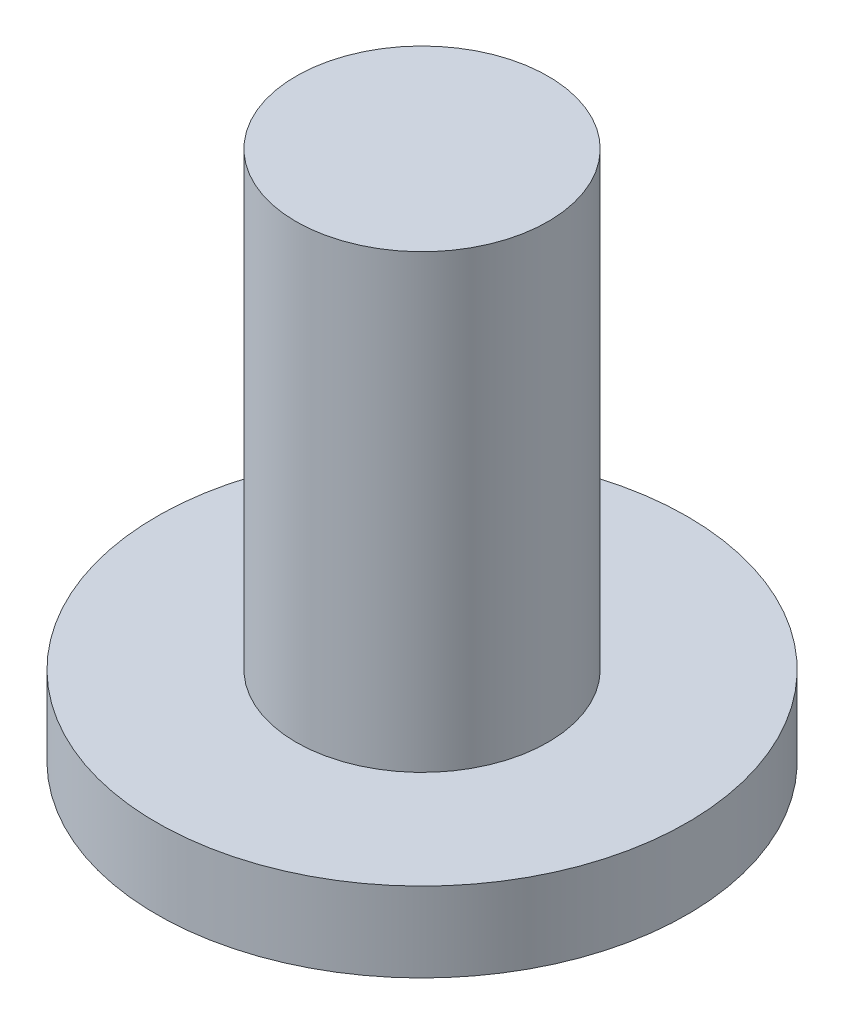
ISO-10303-21;
HEADER;
FILE_DESCRIPTION(('STEP AP214'),'2;1');
FILE_NAME('part.step','',(''),(''),'','','');
FILE_SCHEMA(('AUTOMOTIVE_DESIGN { 1 0 10303 214 1 1 1 1 }'));
ENDSEC;
DATA;
#1=APPLICATION_CONTEXT('core data for automotive mechanical design processes');
#2=APPLICATION_PROTOCOL_DEFINITION('international standard','automotive_design',2000,#1);
#3=PRODUCT_CONTEXT('',#1,'mechanical');
#4=PRODUCT('Part','Part','',(#3));
#5=PRODUCT_RELATED_PRODUCT_CATEGORY('part','',(#4));
#6=PRODUCT_DEFINITION_FORMATION('','',#4);
#7=PRODUCT_DEFINITION_CONTEXT('part definition',#1,'design');
#8=PRODUCT_DEFINITION('design','',#6,#7);
#9=PRODUCT_DEFINITION_SHAPE('','',#8);
#10=(LENGTH_UNIT() NAMED_UNIT(*) SI_UNIT(.MILLI.,.METRE.));
#11=(NAMED_UNIT(*) PLANE_ANGLE_UNIT() SI_UNIT($,.RADIAN.));
#12=(NAMED_UNIT(*) SI_UNIT($,.STERADIAN.) SOLID_ANGLE_UNIT());
#13=UNCERTAINTY_MEASURE_WITH_UNIT(LENGTH_MEASURE(1.E-05),#10,'distance_accuracy_value','');
#14=(GEOMETRIC_REPRESENTATION_CONTEXT(3) GLOBAL_UNCERTAINTY_ASSIGNED_CONTEXT((#13)) GLOBAL_UNIT_ASSIGNED_CONTEXT((#10,
#11,#12)) REPRESENTATION_CONTEXT('',''));
#15=CARTESIAN_POINT('',(0.,0.,0.));
#16=DIRECTION('',(0.,0.,1.));
#17=DIRECTION('',(1.,0.,0.));
#18=AXIS2_PLACEMENT_3D('',#15,#16,#17);
#19=CARTESIAN_POINT('',(0.,17.,0.));
#20=DIRECTION('',(0.,-1.,0.));
#21=DIRECTION('',(0.,0.,-1.));
#22=AXIS2_PLACEMENT_3D('',#19,#20,#21);
#23=CYLINDRICAL_SURFACE('',#22,4.75);
#24=CARTESIAN_POINT('',(0.,17.,0.));
#25=DIRECTION('',(0.,1.,0.));
#26=DIRECTION('',(0.,0.,1.));
#27=AXIS2_PLACEMENT_3D('',#24,#25,#26);
#28=CIRCLE('',#27,4.75);
#29=CARTESIAN_POINT('',(0.,17.,4.75));
#30=VERTEX_POINT('',#29);
#31=EDGE_CURVE('E10',#30,#30,#28,.T.);
#32=ORIENTED_EDGE('',*,*,#31,.F.);
#33=EDGE_LOOP('',(#32));
#34=FACE_BOUND('',#33,.T.);
#35=CARTESIAN_POINT('',(0.,0.,0.));
#36=DIRECTION('',(0.,1.,0.));
#37=DIRECTION('',(0.,0.,1.));
#38=AXIS2_PLACEMENT_3D('',#35,#36,#37);
#39=CIRCLE('',#38,4.75);
#40=CARTESIAN_POINT('',(0.,0.,4.75));
#41=VERTEX_POINT('',#40);
#42=EDGE_CURVE('E44',#41,#41,#39,.T.);
#43=ORIENTED_EDGE('',*,*,#42,.T.);
#44=EDGE_LOOP('',(#43));
#45=FACE_BOUND('',#44,.T.);
#46=ADVANCED_FACE('F41',(#34,#45),#23,.T.);
#47=CARTESIAN_POINT('',(0.,17.,0.));
#48=DIRECTION('',(0.,1.,0.));
#49=DIRECTION('',(0.,0.,1.));
#50=AXIS2_PLACEMENT_3D('',#47,#48,#49);
#51=PLANE('',#50);
#52=ORIENTED_EDGE('',*,*,#31,.T.);
#53=EDGE_LOOP('',(#52));
#54=FACE_BOUND('',#53,.T.);
#55=ADVANCED_FACE('F68',(#54),#51,.T.);
#56=CARTESIAN_POINT('',(0.,-3.,0.));
#57=DIRECTION('',(0.,1.,0.));
#58=DIRECTION('',(0.,0.,1.));
#59=AXIS2_PLACEMENT_3D('',#56,#57,#58);
#60=CYLINDRICAL_SURFACE('',#59,10.);
#61=CARTESIAN_POINT('',(0.,-3.,0.));
#62=DIRECTION('',(0.,-1.,0.));
#63=DIRECTION('',(0.,0.,-1.));
#64=AXIS2_PLACEMENT_3D('',#61,#62,#63);
#65=CIRCLE('',#64,10.);
#66=CARTESIAN_POINT('',(0.,-3.,-10.));
#67=VERTEX_POINT('',#66);
#68=EDGE_CURVE('E54',#67,#67,#65,.T.);
#69=ORIENTED_EDGE('',*,*,#68,.F.);
#70=EDGE_LOOP('',(#69));
#71=FACE_BOUND('',#70,.T.);
#72=CARTESIAN_POINT('',(0.,0.,0.));
#73=DIRECTION('',(0.,-1.,0.));
#74=DIRECTION('',(0.,0.,-1.));
#75=AXIS2_PLACEMENT_3D('',#72,#73,#74);
#76=CIRCLE('',#75,10.);
#77=CARTESIAN_POINT('',(0.,0.,-10.));
#78=VERTEX_POINT('',#77);
#79=EDGE_CURVE('E56',#78,#78,#76,.T.);
#80=ORIENTED_EDGE('',*,*,#79,.T.);
#81=EDGE_LOOP('',(#80));
#82=FACE_BOUND('',#81,.T.);
#83=ADVANCED_FACE('F65',(#71,#82),#60,.T.);
#84=CARTESIAN_POINT('',(0.,-3.,0.));
#85=DIRECTION('',(0.,-1.,0.));
#86=DIRECTION('',(0.,0.,-1.));
#87=AXIS2_PLACEMENT_3D('',#84,#85,#86);
#88=PLANE('',#87);
#89=ORIENTED_EDGE('',*,*,#68,.T.);
#90=EDGE_LOOP('',(#89));
#91=FACE_BOUND('',#90,.T.);
#92=ADVANCED_FACE('F63',(#91),#88,.T.);
#93=CARTESIAN_POINT('',(0.,0.,0.));
#94=DIRECTION('',(0.,-1.,0.));
#95=DIRECTION('',(0.,0.,-1.));
#96=AXIS2_PLACEMENT_3D('',#93,#94,#95);
#97=PLANE('',#96);
#98=ORIENTED_EDGE('',*,*,#42,.F.);
#99=EDGE_LOOP('',(#98));
#100=FACE_BOUND('',#99,.T.);
#101=ORIENTED_EDGE('',*,*,#79,.F.);
#102=EDGE_LOOP('',(#101));
#103=FACE_BOUND('',#102,.T.);
#104=ADVANCED_FACE('F72',(#100,#103),#97,.F.);
#105=CLOSED_SHELL('',(#46,#55,#83,#92,#104));
#106=MANIFOLD_SOLID_BREP('B2',#105);
#107=ADVANCED_BREP_SHAPE_REPRESENTATION('',(#18,#106),#14);
#108=SHAPE_DEFINITION_REPRESENTATION(#9,#107);
ENDSEC;
END-ISO-10303-21;
